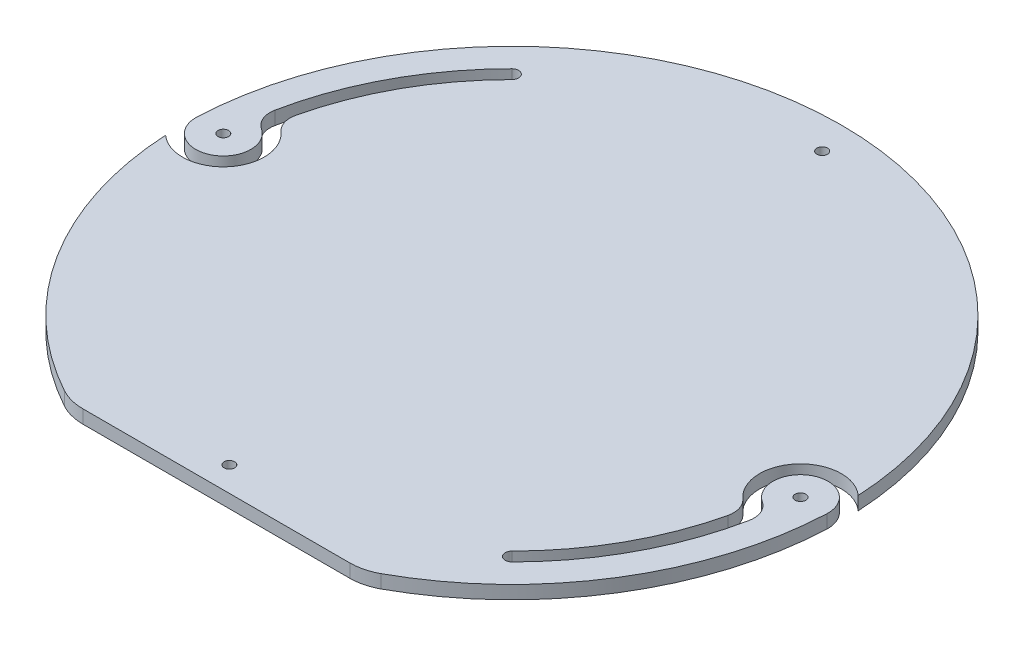
ISO-10303-21;
HEADER;
FILE_DESCRIPTION(('STEP AP214'),'2;1');
FILE_NAME('part.step','',(''),(''),'','','');
FILE_SCHEMA(('AUTOMOTIVE_DESIGN { 1 0 10303 214 1 1 1 1 }'));
ENDSEC;
DATA;
#1=APPLICATION_CONTEXT('core data for automotive mechanical design processes');
#2=APPLICATION_PROTOCOL_DEFINITION('international standard','automotive_design',2000,#1);
#3=PRODUCT_CONTEXT('',#1,'mechanical');
#4=PRODUCT('Part','Part','',(#3));
#5=PRODUCT_RELATED_PRODUCT_CATEGORY('part','',(#4));
#6=PRODUCT_DEFINITION_FORMATION('','',#4);
#7=PRODUCT_DEFINITION_CONTEXT('part definition',#1,'design');
#8=PRODUCT_DEFINITION('design','',#6,#7);
#9=PRODUCT_DEFINITION_SHAPE('','',#8);
#10=(LENGTH_UNIT() NAMED_UNIT(*) SI_UNIT(.MILLI.,.METRE.));
#11=(NAMED_UNIT(*) PLANE_ANGLE_UNIT() SI_UNIT($,.RADIAN.));
#12=(NAMED_UNIT(*) SI_UNIT($,.STERADIAN.) SOLID_ANGLE_UNIT());
#13=UNCERTAINTY_MEASURE_WITH_UNIT(LENGTH_MEASURE(1.E-05),#10,'distance_accuracy_value','');
#14=(GEOMETRIC_REPRESENTATION_CONTEXT(3) GLOBAL_UNCERTAINTY_ASSIGNED_CONTEXT((#13)) GLOBAL_UNIT_ASSIGNED_CONTEXT((#10,
#11,#12)) REPRESENTATION_CONTEXT('',''));
#15=CARTESIAN_POINT('',(0.,0.,0.));
#16=DIRECTION('',(0.,0.,1.));
#17=DIRECTION('',(1.,0.,0.));
#18=AXIS2_PLACEMENT_3D('',#15,#16,#17);
#19=CARTESIAN_POINT('',(0.,3.,0.));
#20=DIRECTION('',(0.,-1.,0.));
#21=DIRECTION('',(0.,0.,-1.));
#22=AXIS2_PLACEMENT_3D('',#19,#20,#21);
#23=CYLINDRICAL_SURFACE('',#22,74.2);
#24=CARTESIAN_POINT('',(0.,3.,0.));
#25=DIRECTION('',(0.,1.,0.));
#26=DIRECTION('',(0.,0.,1.));
#27=AXIS2_PLACEMENT_3D('',#24,#25,#26);
#28=CIRCLE('',#27,74.2);
#29=CARTESIAN_POINT('',(74.0993456822913,3.,-3.86354363975568));
#30=VERTEX_POINT('',#29);
#31=CARTESIAN_POINT('',(-74.1293780413738,3.,-3.23655854250791));
#32=VERTEX_POINT('',#31);
#33=EDGE_CURVE('E328',#30,#32,#28,.T.);
#34=ORIENTED_EDGE('',*,*,#33,.F.);
#35=DIRECTION('',(0.,1.,0.));
#36=VECTOR('',#35,1.);
#37=CARTESIAN_POINT('',(74.0993456822913,0.,-3.86354363975568));
#38=LINE('',#37,#36);
#39=CARTESIAN_POINT('',(74.0993456822913,0.,-3.86354363975568));
#40=VERTEX_POINT('',#39);
#41=EDGE_CURVE('E230',#40,#30,#38,.T.);
#42=ORIENTED_EDGE('',*,*,#41,.F.);
#43=CARTESIAN_POINT('',(0.,0.,0.));
#44=DIRECTION('',(0.,1.,0.));
#45=DIRECTION('',(0.,0.,1.));
#46=AXIS2_PLACEMENT_3D('',#43,#44,#45);
#47=CIRCLE('',#46,74.2);
#48=CARTESIAN_POINT('',(-74.1293780413738,0.,-3.23655854250791));
#49=VERTEX_POINT('',#48);
#50=EDGE_CURVE('E340',#40,#49,#47,.T.);
#51=ORIENTED_EDGE('',*,*,#50,.T.);
#52=DIRECTION('',(0.,1.,0.));
#53=VECTOR('',#52,1.);
#54=CARTESIAN_POINT('',(-74.1293780413738,0.,-3.23655854250791));
#55=LINE('',#54,#53);
#56=EDGE_CURVE('E287',#49,#32,#55,.T.);
#57=ORIENTED_EDGE('',*,*,#56,.T.);
#58=EDGE_LOOP('',(#34,#42,#51,#57));
#59=FACE_BOUND('',#58,.T.);
#60=ADVANCED_FACE('F33',(#59),#23,.T.);
#61=CARTESIAN_POINT('',(-74.0993456822913,3.,3.86354363975568));
#62=VERTEX_POINT('',#61);
#63=CARTESIAN_POINT('',(-35.6515891230551,3.,65.0738364705882));
#64=VERTEX_POINT('',#63);
#65=EDGE_CURVE('E322',#62,#64,#28,.T.);
#66=ORIENTED_EDGE('',*,*,#65,.F.);
#67=DIRECTION('',(0.,1.,0.));
#68=VECTOR('',#67,1.);
#69=CARTESIAN_POINT('',(-74.0993456822913,0.,3.86354363975568));
#70=LINE('',#69,#68);
#71=CARTESIAN_POINT('',(-74.0993456822913,0.,3.86354363975568));
#72=VERTEX_POINT('',#71);
#73=EDGE_CURVE('E285',#72,#62,#70,.T.);
#74=ORIENTED_EDGE('',*,*,#73,.F.);
#75=CARTESIAN_POINT('',(-35.6515891230551,0.,65.0738364705882));
#76=VERTEX_POINT('',#75);
#77=EDGE_CURVE('E335',#72,#76,#47,.T.);
#78=ORIENTED_EDGE('',*,*,#77,.T.);
#79=DIRECTION('',(0.,-1.,0.));
#80=VECTOR('',#79,1.);
#81=CARTESIAN_POINT('',(-35.6515891230551,3.,65.0738364705882));
#82=LINE('',#81,#80);
#83=EDGE_CURVE('E41',#64,#76,#82,.T.);
#84=ORIENTED_EDGE('',*,*,#83,.F.);
#85=EDGE_LOOP('',(#66,#74,#78,#84));
#86=FACE_BOUND('',#85,.T.);
#87=ADVANCED_FACE('F384',(#86),#23,.T.);
#88=CARTESIAN_POINT('',(30.0299773610639,3.,54.8128676470588));
#89=DIRECTION('',(0.,-1.,0.));
#90=DIRECTION('',(0.,0.,-1.));
#91=AXIS2_PLACEMENT_3D('',#88,#89,#90);
#92=CYLINDRICAL_SURFACE('',#91,11.7);
#93=CARTESIAN_POINT('',(30.0299773610639,0.,54.8128676470588));
#94=DIRECTION('',(0.,1.,0.));
#95=DIRECTION('',(0.,0.,1.));
#96=AXIS2_PLACEMENT_3D('',#93,#94,#95);
#97=CIRCLE('',#96,11.7);
#98=CARTESIAN_POINT('',(30.0299773610639,0.,66.5128676470588));
#99=VERTEX_POINT('',#98);
#100=CARTESIAN_POINT('',(35.6515891230551,0.,65.0738364705882));
#101=VERTEX_POINT('',#100);
#102=EDGE_CURVE('E316',#99,#101,#97,.T.);
#103=ORIENTED_EDGE('',*,*,#102,.T.);
#104=DIRECTION('',(0.,-1.,0.));
#105=VECTOR('',#104,1.);
#106=CARTESIAN_POINT('',(35.6515891230551,3.,65.0738364705882));
#107=LINE('',#106,#105);
#108=CARTESIAN_POINT('',(35.6515891230551,3.,65.0738364705882));
#109=VERTEX_POINT('',#108);
#110=EDGE_CURVE('E11',#109,#101,#107,.T.);
#111=ORIENTED_EDGE('',*,*,#110,.F.);
#112=CARTESIAN_POINT('',(30.0299773610639,3.,54.8128676470588));
#113=DIRECTION('',(0.,1.,0.));
#114=DIRECTION('',(0.,0.,1.));
#115=AXIS2_PLACEMENT_3D('',#112,#113,#114);
#116=CIRCLE('',#115,11.7);
#117=CARTESIAN_POINT('',(30.0299773610639,3.,66.5128676470588));
#118=VERTEX_POINT('',#117);
#119=EDGE_CURVE('E319',#118,#109,#116,.T.);
#120=ORIENTED_EDGE('',*,*,#119,.F.);
#121=DIRECTION('',(0.,-1.,0.));
#122=VECTOR('',#121,1.);
#123=CARTESIAN_POINT('',(30.0299773610639,3.,66.5128676470588));
#124=LINE('',#123,#122);
#125=EDGE_CURVE('E332',#118,#99,#124,.T.);
#126=ORIENTED_EDGE('',*,*,#125,.T.);
#127=EDGE_LOOP('',(#103,#111,#120,#126));
#128=FACE_BOUND('',#127,.T.);
#129=ADVANCED_FACE('F35',(#128),#92,.T.);
#130=CARTESIAN_POINT('',(74.1293780413738,0.,3.23655854250794));
#131=VERTEX_POINT('',#130);
#132=EDGE_CURVE('E336',#101,#131,#47,.T.);
#133=ORIENTED_EDGE('',*,*,#132,.T.);
#134=DIRECTION('',(0.,1.,0.));
#135=VECTOR('',#134,1.);
#136=CARTESIAN_POINT('',(74.1293780413738,0.,3.23655854250794));
#137=LINE('',#136,#135);
#138=CARTESIAN_POINT('',(74.1293780413738,3.,3.23655854250794));
#139=VERTEX_POINT('',#138);
#140=EDGE_CURVE('E232',#131,#139,#137,.T.);
#141=ORIENTED_EDGE('',*,*,#140,.T.);
#142=EDGE_CURVE('E324',#109,#139,#28,.T.);
#143=ORIENTED_EDGE('',*,*,#142,.F.);
#144=ORIENTED_EDGE('',*,*,#110,.T.);
#145=EDGE_LOOP('',(#133,#141,#143,#144));
#146=FACE_BOUND('',#145,.T.);
#147=ADVANCED_FACE('F412',(#146),#23,.T.);
#148=CARTESIAN_POINT('',(-30.0299773610639,3.,54.8128676470588));
#149=DIRECTION('',(0.,-1.,0.));
#150=DIRECTION('',(0.,0.,-1.));
#151=AXIS2_PLACEMENT_3D('',#148,#149,#150);
#152=CYLINDRICAL_SURFACE('',#151,11.7);
#153=CARTESIAN_POINT('',(-30.0299773610639,0.,54.8128676470588));
#154=DIRECTION('',(0.,1.,0.));
#155=DIRECTION('',(0.,0.,-1.));
#156=AXIS2_PLACEMENT_3D('',#153,#154,#155);
#157=CIRCLE('',#156,11.7);
#158=CARTESIAN_POINT('',(-30.0299773610639,0.,66.5128676470588));
#159=VERTEX_POINT('',#158);
#160=EDGE_CURVE('E339',#76,#159,#157,.T.);
#161=ORIENTED_EDGE('',*,*,#160,.T.);
#162=DIRECTION('',(0.,-1.,0.));
#163=VECTOR('',#162,1.);
#164=CARTESIAN_POINT('',(-30.0299773610639,3.,66.5128676470588));
#165=LINE('',#164,#163);
#166=CARTESIAN_POINT('',(-30.0299773610639,3.,66.5128676470588));
#167=VERTEX_POINT('',#166);
#168=EDGE_CURVE('E345',#167,#159,#165,.T.);
#169=ORIENTED_EDGE('',*,*,#168,.F.);
#170=CARTESIAN_POINT('',(-30.0299773610639,3.,54.8128676470588));
#171=DIRECTION('',(0.,1.,0.));
#172=DIRECTION('',(0.,0.,-1.));
#173=AXIS2_PLACEMENT_3D('',#170,#171,#172);
#174=CIRCLE('',#173,11.7);
#175=EDGE_CURVE('E327',#64,#167,#174,.T.);
#176=ORIENTED_EDGE('',*,*,#175,.F.);
#177=ORIENTED_EDGE('',*,*,#83,.T.);
#178=EDGE_LOOP('',(#161,#169,#176,#177));
#179=FACE_BOUND('',#178,.T.);
#180=ADVANCED_FACE('F352',(#179),#152,.T.);
#181=CARTESIAN_POINT('',(-30.0299773610639,3.,66.5128676470588));
#182=DIRECTION('',(0.,0.,-1.));
#183=DIRECTION('',(-1.,0.,0.));
#184=AXIS2_PLACEMENT_3D('',#181,#182,#183);
#185=PLANE('',#184);
#186=DIRECTION('',(1.,0.,0.));
#187=VECTOR('',#186,1.);
#188=CARTESIAN_POINT('',(-30.0299773610639,0.,66.5128676470588));
#189=LINE('',#188,#187);
#190=EDGE_CURVE('E323',#159,#99,#189,.T.);
#191=ORIENTED_EDGE('',*,*,#190,.T.);
#192=ORIENTED_EDGE('',*,*,#125,.F.);
#193=DIRECTION('',(1.,0.,0.));
#194=VECTOR('',#193,1.);
#195=CARTESIAN_POINT('',(-30.0299773610639,3.,66.5128676470588));
#196=LINE('',#195,#194);
#197=EDGE_CURVE('E330',#167,#118,#196,.T.);
#198=ORIENTED_EDGE('',*,*,#197,.F.);
#199=ORIENTED_EDGE('',*,*,#168,.T.);
#200=EDGE_LOOP('',(#191,#192,#198,#199));
#201=FACE_BOUND('',#200,.T.);
#202=ADVANCED_FACE('F361',(#201),#185,.F.);
#203=CARTESIAN_POINT('',(30.0299773610639,3.,54.8128676470588));
#204=DIRECTION('',(0.,1.,0.));
#205=DIRECTION('',(0.,0.,1.));
#206=AXIS2_PLACEMENT_3D('',#203,#204,#205);
#207=PLANE('',#206);
#208=CARTESIAN_POINT('',(67.9352790675663,3.,2.96611834084284));
#209=DIRECTION('',(0.,1.,0.));
#210=DIRECTION('',(0.,0.,-1.));
#211=AXIS2_PLACEMENT_3D('',#208,#209,#210);
#212=CIRCLE('',#211,9.2);
#213=CARTESIAN_POINT('',(61.7919150492533,3.,9.81440853172245));
#214=VERTEX_POINT('',#213);
#215=EDGE_CURVE('E218',#30,#214,#212,.T.);
#216=ORIENTED_EDGE('',*,*,#215,.F.);
#217=ORIENTED_EDGE('',*,*,#33,.T.);
#218=CARTESIAN_POINT('',(-67.9352790675663,3.,-2.96611834084284));
#219=DIRECTION('',(0.,-1.,0.));
#220=DIRECTION('',(0.,0.,1.));
#221=AXIS2_PLACEMENT_3D('',#218,#219,#220);
#222=CIRCLE('',#221,6.19999999999998);
#223=CARTESIAN_POINT('',(-64.5293719082212,3.,-8.14683223198966));
#224=VERTEX_POINT('',#223);
#225=EDGE_CURVE('E267',#224,#32,#222,.T.);
#226=ORIENTED_EDGE('',*,*,#225,.F.);
#227=CARTESIAN_POINT('',(-61.7826725861687,3.,-12.3248273054952));
#228=DIRECTION('',(0.,1.,0.));
#229=DIRECTION('',(0.,0.,-1.));
#230=AXIS2_PLACEMENT_3D('',#227,#228,#229);
#231=CIRCLE('',#230,5.);
#232=CARTESIAN_POINT('',(-66.6860592993567,3.,-13.3029882027567));
#233=VERTEX_POINT('',#232);
#234=EDGE_CURVE('E264',#233,#224,#231,.T.);
#235=ORIENTED_EDGE('',*,*,#234,.F.);
#236=CARTESIAN_POINT('',(0.,3.,0.));
#237=DIRECTION('',(0.,1.,0.));
#238=DIRECTION('',(0.,0.,-1.));
#239=AXIS2_PLACEMENT_3D('',#236,#237,#238);
#240=CIRCLE('',#239,68.);
#241=CARTESIAN_POINT('',(-48.0832611206855,3.,-48.083261120685));
#242=VERTEX_POINT('',#241);
#243=EDGE_CURVE('E261',#242,#233,#240,.T.);
#244=ORIENTED_EDGE('',*,*,#243,.F.);
#245=CARTESIAN_POINT('',(-47.0226009489056,3.,-47.0226009489051));
#246=DIRECTION('',(0.,1.,0.));
#247=DIRECTION('',(0.,0.,1.));
#248=AXIS2_PLACEMENT_3D('',#245,#246,#247);
#249=CIRCLE('',#248,1.5);
#250=CARTESIAN_POINT('',(-45.9619407771258,3.,-45.9619407771253));
#251=VERTEX_POINT('',#250);
#252=EDGE_CURVE('E225',#251,#242,#249,.T.);
#253=ORIENTED_EDGE('',*,*,#252,.F.);
#254=CARTESIAN_POINT('',(0.,3.,0.));
#255=DIRECTION('',(0.,-1.,0.));
#256=DIRECTION('',(0.,0.,1.));
#257=AXIS2_PLACEMENT_3D('',#254,#255,#256);
#258=CIRCLE('',#257,65.);
#259=CARTESIAN_POINT('',(-63.3242244447496,3.,-14.6643308224744));
#260=VERTEX_POINT('',#259);
#261=EDGE_CURVE('E242',#260,#251,#258,.T.);
#262=ORIENTED_EDGE('',*,*,#261,.F.);
#263=CARTESIAN_POINT('',(-58.453130256692,3.,-13.5363053745918));
#264=DIRECTION('',(0.,-1.,0.));
#265=DIRECTION('',(0.,0.,1.));
#266=AXIS2_PLACEMENT_3D('',#263,#264,#265);
#267=CIRCLE('',#266,4.99999999999999);
#268=CARTESIAN_POINT('',(-61.7919150492533,3.,-9.81440853172244));
#269=VERTEX_POINT('',#268);
#270=EDGE_CURVE('E273',#269,#260,#267,.T.);
#271=ORIENTED_EDGE('',*,*,#270,.F.);
#272=CARTESIAN_POINT('',(-67.9352790675663,3.,-2.96611834084284));
#273=DIRECTION('',(0.,1.,0.));
#274=DIRECTION('',(0.,0.,-1.));
#275=AXIS2_PLACEMENT_3D('',#272,#273,#274);
#276=CIRCLE('',#275,9.19999999999999);
#277=EDGE_CURVE('E270',#62,#269,#276,.T.);
#278=ORIENTED_EDGE('',*,*,#277,.F.);
#279=ORIENTED_EDGE('',*,*,#65,.T.);
#280=ORIENTED_EDGE('',*,*,#175,.T.);
#281=ORIENTED_EDGE('',*,*,#197,.T.);
#282=ORIENTED_EDGE('',*,*,#119,.T.);
#283=ORIENTED_EDGE('',*,*,#142,.T.);
#284=CARTESIAN_POINT('',(67.9352790675663,3.,2.96611834084284));
#285=DIRECTION('',(0.,-1.,0.));
#286=DIRECTION('',(0.,0.,1.));
#287=AXIS2_PLACEMENT_3D('',#284,#285,#286);
#288=CIRCLE('',#287,6.20000000000001);
#289=CARTESIAN_POINT('',(64.5293719082212,3.,8.14683223198967));
#290=VERTEX_POINT('',#289);
#291=EDGE_CURVE('E216',#290,#139,#288,.T.);
#292=ORIENTED_EDGE('',*,*,#291,.F.);
#293=CARTESIAN_POINT('',(61.7826725861687,3.,12.3248273054952));
#294=DIRECTION('',(0.,1.,0.));
#295=DIRECTION('',(0.,0.,-1.));
#296=AXIS2_PLACEMENT_3D('',#293,#294,#295);
#297=CIRCLE('',#296,5.);
#298=CARTESIAN_POINT('',(66.6860592993567,3.,13.3029882027567));
#299=VERTEX_POINT('',#298);
#300=EDGE_CURVE('E213',#299,#290,#297,.T.);
#301=ORIENTED_EDGE('',*,*,#300,.F.);
#302=CARTESIAN_POINT('',(0.,3.,0.));
#303=DIRECTION('',(0.,1.,0.));
#304=DIRECTION('',(0.,0.,-1.));
#305=AXIS2_PLACEMENT_3D('',#302,#303,#304);
#306=CIRCLE('',#305,68.);
#307=CARTESIAN_POINT('',(48.0832611206854,3.,48.083261120685));
#308=VERTEX_POINT('',#307);
#309=EDGE_CURVE('E211',#308,#299,#306,.T.);
#310=ORIENTED_EDGE('',*,*,#309,.F.);
#311=CARTESIAN_POINT('',(47.0226009489056,3.,47.0226009489051));
#312=DIRECTION('',(0.,1.,0.));
#313=DIRECTION('',(0.,0.,1.));
#314=AXIS2_PLACEMENT_3D('',#311,#312,#313);
#315=CIRCLE('',#314,1.5);
#316=CARTESIAN_POINT('',(45.9619407771258,3.,45.9619407771253));
#317=VERTEX_POINT('',#316);
#318=EDGE_CURVE('E177',#317,#308,#315,.T.);
#319=ORIENTED_EDGE('',*,*,#318,.F.);
#320=CARTESIAN_POINT('',(0.,3.,0.));
#321=DIRECTION('',(0.,-1.,0.));
#322=DIRECTION('',(0.,0.,1.));
#323=AXIS2_PLACEMENT_3D('',#320,#321,#322);
#324=CIRCLE('',#323,65.);
#325=CARTESIAN_POINT('',(63.3242244447496,3.,14.6643308224744));
#326=VERTEX_POINT('',#325);
#327=EDGE_CURVE('E194',#326,#317,#324,.T.);
#328=ORIENTED_EDGE('',*,*,#327,.F.);
#329=CARTESIAN_POINT('',(58.4531302566919,3.,13.5363053745918));
#330=DIRECTION('',(0.,-1.,0.));
#331=DIRECTION('',(0.,0.,1.));
#332=AXIS2_PLACEMENT_3D('',#329,#330,#331);
#333=CIRCLE('',#332,4.99999999999999);
#334=EDGE_CURVE('E197',#214,#326,#333,.T.);
#335=ORIENTED_EDGE('',*,*,#334,.F.);
#336=EDGE_LOOP('',(#216,#217,#226,#235,#244,#253,#262,#271,#278,#279,#280,#281,#282,#283,#292,
#301,#310,#319,#328,#335));
#337=FACE_BOUND('',#336,.T.);
#338=CARTESIAN_POINT('',(-67.9352790675663,3.,-2.96611834084284));
#339=DIRECTION('',(0.,1.,0.));
#340=DIRECTION('',(0.,0.,1.));
#341=AXIS2_PLACEMENT_3D('',#338,#339,#340);
#342=CIRCLE('',#341,1.2);
#343=CARTESIAN_POINT('',(-67.9352790675663,3.,-1.76611834084284));
#344=VERTEX_POINT('',#343);
#345=EDGE_CURVE('E299',#344,#344,#342,.T.);
#346=ORIENTED_EDGE('',*,*,#345,.F.);
#347=EDGE_LOOP('',(#346));
#348=FACE_BOUND('',#347,.T.);
#349=CARTESIAN_POINT('',(2.9224989534775,3.,-66.9362308459845));
#350=DIRECTION('',(0.,1.,0.));
#351=DIRECTION('',(0.,0.,1.));
#352=AXIS2_PLACEMENT_3D('',#349,#350,#351);
#353=CIRCLE('',#352,1.2);
#354=CARTESIAN_POINT('',(2.9224989534775,3.,-65.7362308459845));
#355=VERTEX_POINT('',#354);
#356=EDGE_CURVE('E305',#355,#355,#353,.T.);
#357=ORIENTED_EDGE('',*,*,#356,.F.);
#358=EDGE_LOOP('',(#357));
#359=FACE_BOUND('',#358,.T.);
#360=CARTESIAN_POINT('',(67.9352790675663,3.,2.96611834084284));
#361=DIRECTION('',(0.,1.,0.));
#362=DIRECTION('',(0.,0.,1.));
#363=AXIS2_PLACEMENT_3D('',#360,#361,#362);
#364=CIRCLE('',#363,1.2);
#365=CARTESIAN_POINT('',(67.9352790675663,3.,4.16611834084284));
#366=VERTEX_POINT('',#365);
#367=EDGE_CURVE('E280',#366,#366,#364,.T.);
#368=ORIENTED_EDGE('',*,*,#367,.F.);
#369=EDGE_LOOP('',(#368));
#370=FACE_BOUND('',#369,.T.);
#371=CARTESIAN_POINT('',(-2.66078262928549,3.,60.9419415164933));
#372=DIRECTION('',(0.,1.,0.));
#373=DIRECTION('',(0.,0.,1.));
#374=AXIS2_PLACEMENT_3D('',#371,#372,#373);
#375=CIRCLE('',#374,1.2);
#376=CARTESIAN_POINT('',(-2.66078262928549,3.,62.1419415164933));
#377=VERTEX_POINT('',#376);
#378=EDGE_CURVE('E298',#377,#377,#375,.T.);
#379=ORIENTED_EDGE('',*,*,#378,.F.);
#380=EDGE_LOOP('',(#379));
#381=FACE_BOUND('',#380,.T.);
#382=ADVANCED_FACE('F368',(#337,#348,#359,#370,#381),#207,.T.);
#383=CARTESIAN_POINT('',(30.0299773610639,0.,54.8128676470588));
#384=DIRECTION('',(0.,1.,0.));
#385=DIRECTION('',(0.,0.,1.));
#386=AXIS2_PLACEMENT_3D('',#383,#384,#385);
#387=PLANE('',#386);
#388=ORIENTED_EDGE('',*,*,#50,.F.);
#389=CARTESIAN_POINT('',(67.9352790675663,0.,2.96611834084284));
#390=DIRECTION('',(0.,1.,0.));
#391=DIRECTION('',(0.,0.,-1.));
#392=AXIS2_PLACEMENT_3D('',#389,#390,#391);
#393=CIRCLE('',#392,9.2);
#394=CARTESIAN_POINT('',(61.7919150492533,0.,9.81440853172245));
#395=VERTEX_POINT('',#394);
#396=EDGE_CURVE('E204',#40,#395,#393,.T.);
#397=ORIENTED_EDGE('',*,*,#396,.T.);
#398=CARTESIAN_POINT('',(58.4531302566919,0.,13.5363053745918));
#399=DIRECTION('',(0.,-1.,0.));
#400=DIRECTION('',(0.,0.,1.));
#401=AXIS2_PLACEMENT_3D('',#398,#399,#400);
#402=CIRCLE('',#401,4.99999999999999);
#403=CARTESIAN_POINT('',(63.3242244447496,0.,14.6643308224744));
#404=VERTEX_POINT('',#403);
#405=EDGE_CURVE('E207',#395,#404,#402,.T.);
#406=ORIENTED_EDGE('',*,*,#405,.T.);
#407=CARTESIAN_POINT('',(0.,0.,0.));
#408=DIRECTION('',(0.,-1.,0.));
#409=DIRECTION('',(0.,0.,1.));
#410=AXIS2_PLACEMENT_3D('',#407,#408,#409);
#411=CIRCLE('',#410,65.);
#412=CARTESIAN_POINT('',(45.9619407771258,0.,45.9619407771253));
#413=VERTEX_POINT('',#412);
#414=EDGE_CURVE('E182',#404,#413,#411,.T.);
#415=ORIENTED_EDGE('',*,*,#414,.T.);
#416=CARTESIAN_POINT('',(47.0226009489056,0.,47.0226009489051));
#417=DIRECTION('',(0.,1.,0.));
#418=DIRECTION('',(0.,0.,1.));
#419=AXIS2_PLACEMENT_3D('',#416,#417,#418);
#420=CIRCLE('',#419,1.5);
#421=CARTESIAN_POINT('',(48.0832611206854,0.,48.083261120685));
#422=VERTEX_POINT('',#421);
#423=EDGE_CURVE('E174',#413,#422,#420,.T.);
#424=ORIENTED_EDGE('',*,*,#423,.T.);
#425=CARTESIAN_POINT('',(0.,0.,0.));
#426=DIRECTION('',(0.,1.,0.));
#427=DIRECTION('',(0.,0.,-1.));
#428=AXIS2_PLACEMENT_3D('',#425,#426,#427);
#429=CIRCLE('',#428,68.);
#430=CARTESIAN_POINT('',(66.6860592993567,0.,13.3029882027567));
#431=VERTEX_POINT('',#430);
#432=EDGE_CURVE('E185',#422,#431,#429,.T.);
#433=ORIENTED_EDGE('',*,*,#432,.T.);
#434=CARTESIAN_POINT('',(61.7826725861687,0.,12.3248273054952));
#435=DIRECTION('',(0.,1.,0.));
#436=DIRECTION('',(0.,0.,-1.));
#437=AXIS2_PLACEMENT_3D('',#434,#435,#436);
#438=CIRCLE('',#437,5.);
#439=CARTESIAN_POINT('',(64.5293719082212,0.,8.14683223198967));
#440=VERTEX_POINT('',#439);
#441=EDGE_CURVE('E48',#431,#440,#438,.T.);
#442=ORIENTED_EDGE('',*,*,#441,.T.);
#443=CARTESIAN_POINT('',(67.9352790675663,0.,2.96611834084284));
#444=DIRECTION('',(0.,-1.,0.));
#445=DIRECTION('',(0.,0.,1.));
#446=AXIS2_PLACEMENT_3D('',#443,#444,#445);
#447=CIRCLE('',#446,6.20000000000001);
#448=EDGE_CURVE('E201',#440,#131,#447,.T.);
#449=ORIENTED_EDGE('',*,*,#448,.T.);
#450=ORIENTED_EDGE('',*,*,#132,.F.);
#451=ORIENTED_EDGE('',*,*,#102,.F.);
#452=ORIENTED_EDGE('',*,*,#190,.F.);
#453=ORIENTED_EDGE('',*,*,#160,.F.);
#454=ORIENTED_EDGE('',*,*,#77,.F.);
#455=CARTESIAN_POINT('',(-67.9352790675663,0.,-2.96611834084284));
#456=DIRECTION('',(0.,1.,0.));
#457=DIRECTION('',(0.,0.,-1.));
#458=AXIS2_PLACEMENT_3D('',#455,#456,#457);
#459=CIRCLE('',#458,9.19999999999999);
#460=CARTESIAN_POINT('',(-61.7919150492533,0.,-9.81440853172244));
#461=VERTEX_POINT('',#460);
#462=EDGE_CURVE('E249',#72,#461,#459,.T.);
#463=ORIENTED_EDGE('',*,*,#462,.T.);
#464=CARTESIAN_POINT('',(-58.453130256692,0.,-13.5363053745918));
#465=DIRECTION('',(0.,-1.,0.));
#466=DIRECTION('',(0.,0.,1.));
#467=AXIS2_PLACEMENT_3D('',#464,#465,#466);
#468=CIRCLE('',#467,4.99999999999999);
#469=CARTESIAN_POINT('',(-63.3242244447496,0.,-14.6643308224744));
#470=VERTEX_POINT('',#469);
#471=EDGE_CURVE('E252',#461,#470,#468,.T.);
#472=ORIENTED_EDGE('',*,*,#471,.T.);
#473=CARTESIAN_POINT('',(0.,0.,0.));
#474=DIRECTION('',(0.,-1.,0.));
#475=DIRECTION('',(0.,0.,1.));
#476=AXIS2_PLACEMENT_3D('',#473,#474,#475);
#477=CIRCLE('',#476,65.);
#478=CARTESIAN_POINT('',(-45.9619407771258,0.,-45.9619407771253));
#479=VERTEX_POINT('',#478);
#480=EDGE_CURVE('E255',#470,#479,#477,.T.);
#481=ORIENTED_EDGE('',*,*,#480,.T.);
#482=CARTESIAN_POINT('',(-47.0226009489056,0.,-47.0226009489051));
#483=DIRECTION('',(0.,1.,0.));
#484=DIRECTION('',(0.,0.,1.));
#485=AXIS2_PLACEMENT_3D('',#482,#483,#484);
#486=CIRCLE('',#485,1.5);
#487=CARTESIAN_POINT('',(-48.0832611206855,0.,-48.083261120685));
#488=VERTEX_POINT('',#487);
#489=EDGE_CURVE('E238',#479,#488,#486,.T.);
#490=ORIENTED_EDGE('',*,*,#489,.T.);
#491=CARTESIAN_POINT('',(0.,0.,0.));
#492=DIRECTION('',(0.,1.,0.));
#493=DIRECTION('',(0.,0.,-1.));
#494=AXIS2_PLACEMENT_3D('',#491,#492,#493);
#495=CIRCLE('',#494,68.);
#496=CARTESIAN_POINT('',(-66.6860592993567,0.,-13.3029882027567));
#497=VERTEX_POINT('',#496);
#498=EDGE_CURVE('E241',#488,#497,#495,.T.);
#499=ORIENTED_EDGE('',*,*,#498,.T.);
#500=CARTESIAN_POINT('',(-61.7826725861687,0.,-12.3248273054952));
#501=DIRECTION('',(0.,1.,0.));
#502=DIRECTION('',(0.,0.,-1.));
#503=AXIS2_PLACEMENT_3D('',#500,#501,#502);
#504=CIRCLE('',#503,5.);
#505=CARTESIAN_POINT('',(-64.5293719082212,0.,-8.14683223198966));
#506=VERTEX_POINT('',#505);
#507=EDGE_CURVE('E56',#497,#506,#504,.T.);
#508=ORIENTED_EDGE('',*,*,#507,.T.);
#509=CARTESIAN_POINT('',(-67.9352790675663,0.,-2.96611834084284));
#510=DIRECTION('',(0.,-1.,0.));
#511=DIRECTION('',(0.,0.,1.));
#512=AXIS2_PLACEMENT_3D('',#509,#510,#511);
#513=CIRCLE('',#512,6.19999999999998);
#514=EDGE_CURVE('E246',#506,#49,#513,.T.);
#515=ORIENTED_EDGE('',*,*,#514,.T.);
#516=EDGE_LOOP('',(#388,#397,#406,#415,#424,#433,#442,#449,#450,#451,#452,#453,#454,#463,#472,
#481,#490,#499,#508,#515));
#517=FACE_BOUND('',#516,.T.);
#518=CARTESIAN_POINT('',(-67.9352790675663,0.,-2.96611834084284));
#519=DIRECTION('',(0.,1.,0.));
#520=DIRECTION('',(0.,0.,1.));
#521=AXIS2_PLACEMENT_3D('',#518,#519,#520);
#522=CIRCLE('',#521,1.2);
#523=CARTESIAN_POINT('',(-67.9352790675663,0.,-1.76611834084284));
#524=VERTEX_POINT('',#523);
#525=EDGE_CURVE('E295',#524,#524,#522,.T.);
#526=ORIENTED_EDGE('',*,*,#525,.T.);
#527=EDGE_LOOP('',(#526));
#528=FACE_BOUND('',#527,.T.);
#529=CARTESIAN_POINT('',(2.9224989534775,0.,-66.9362308459845));
#530=DIRECTION('',(0.,1.,0.));
#531=DIRECTION('',(0.,0.,1.));
#532=AXIS2_PLACEMENT_3D('',#529,#530,#531);
#533=CIRCLE('',#532,1.2);
#534=CARTESIAN_POINT('',(2.9224989534775,0.,-65.7362308459845));
#535=VERTEX_POINT('',#534);
#536=EDGE_CURVE('E302',#535,#535,#533,.T.);
#537=ORIENTED_EDGE('',*,*,#536,.T.);
#538=EDGE_LOOP('',(#537));
#539=FACE_BOUND('',#538,.T.);
#540=CARTESIAN_POINT('',(67.9352790675663,0.,2.96611834084284));
#541=DIRECTION('',(0.,1.,0.));
#542=DIRECTION('',(0.,0.,1.));
#543=AXIS2_PLACEMENT_3D('',#540,#541,#542);
#544=CIRCLE('',#543,1.2);
#545=CARTESIAN_POINT('',(67.9352790675663,0.,4.16611834084284));
#546=VERTEX_POINT('',#545);
#547=EDGE_CURVE('E308',#546,#546,#544,.T.);
#548=ORIENTED_EDGE('',*,*,#547,.T.);
#549=EDGE_LOOP('',(#548));
#550=FACE_BOUND('',#549,.T.);
#551=CARTESIAN_POINT('',(-2.66078262928549,0.,60.9419415164933));
#552=DIRECTION('',(0.,1.,0.));
#553=DIRECTION('',(0.,0.,1.));
#554=AXIS2_PLACEMENT_3D('',#551,#552,#553);
#555=CIRCLE('',#554,1.2);
#556=CARTESIAN_POINT('',(-2.66078262928549,0.,62.1419415164933));
#557=VERTEX_POINT('',#556);
#558=EDGE_CURVE('E313',#557,#557,#555,.T.);
#559=ORIENTED_EDGE('',*,*,#558,.T.);
#560=EDGE_LOOP('',(#559));
#561=FACE_BOUND('',#560,.T.);
#562=ADVANCED_FACE('F190',(#517,#528,#539,#550,#561),#387,.F.);
#563=CARTESIAN_POINT('',(-2.66078262928549,0.,60.9419415164933));
#564=DIRECTION('',(0.,1.,0.));
#565=DIRECTION('',(0.,0.,1.));
#566=AXIS2_PLACEMENT_3D('',#563,#564,#565);
#567=CYLINDRICAL_SURFACE('',#566,1.2);
#568=ORIENTED_EDGE('',*,*,#558,.F.);
#569=EDGE_LOOP('',(#568));
#570=FACE_BOUND('',#569,.T.);
#571=ORIENTED_EDGE('',*,*,#378,.T.);
#572=EDGE_LOOP('',(#571));
#573=FACE_BOUND('',#572,.T.);
#574=ADVANCED_FACE('F573',(#570,#573),#567,.F.);
#575=CARTESIAN_POINT('',(67.9352790675663,0.,2.96611834084284));
#576=DIRECTION('',(0.,1.,0.));
#577=DIRECTION('',(0.,0.,1.));
#578=AXIS2_PLACEMENT_3D('',#575,#576,#577);
#579=CYLINDRICAL_SURFACE('',#578,1.2);
#580=ORIENTED_EDGE('',*,*,#547,.F.);
#581=EDGE_LOOP('',(#580));
#582=FACE_BOUND('',#581,.T.);
#583=ORIENTED_EDGE('',*,*,#367,.T.);
#584=EDGE_LOOP('',(#583));
#585=FACE_BOUND('',#584,.T.);
#586=ADVANCED_FACE('F564',(#582,#585),#579,.F.);
#587=CARTESIAN_POINT('',(2.9224989534775,0.,-66.9362308459845));
#588=DIRECTION('',(0.,1.,0.));
#589=DIRECTION('',(0.,0.,1.));
#590=AXIS2_PLACEMENT_3D('',#587,#588,#589);
#591=CYLINDRICAL_SURFACE('',#590,1.2);
#592=ORIENTED_EDGE('',*,*,#536,.F.);
#593=EDGE_LOOP('',(#592));
#594=FACE_BOUND('',#593,.T.);
#595=ORIENTED_EDGE('',*,*,#356,.T.);
#596=EDGE_LOOP('',(#595));
#597=FACE_BOUND('',#596,.T.);
#598=ADVANCED_FACE('F555',(#594,#597),#591,.F.);
#599=CARTESIAN_POINT('',(-67.9352790675663,0.,-2.96611834084284));
#600=DIRECTION('',(0.,1.,0.));
#601=DIRECTION('',(0.,0.,1.));
#602=AXIS2_PLACEMENT_3D('',#599,#600,#601);
#603=CYLINDRICAL_SURFACE('',#602,1.2);
#604=ORIENTED_EDGE('',*,*,#525,.F.);
#605=EDGE_LOOP('',(#604));
#606=FACE_BOUND('',#605,.T.);
#607=ORIENTED_EDGE('',*,*,#345,.T.);
#608=EDGE_LOOP('',(#607));
#609=FACE_BOUND('',#608,.T.);
#610=ADVANCED_FACE('F537',(#606,#609),#603,.F.);
#611=CARTESIAN_POINT('',(-47.0226009489056,0.,-47.0226009489051));
#612=DIRECTION('',(0.,1.,0.));
#613=DIRECTION('',(0.,0.,1.));
#614=AXIS2_PLACEMENT_3D('',#611,#612,#613);
#615=CYLINDRICAL_SURFACE('',#614,1.5);
#616=ORIENTED_EDGE('',*,*,#252,.T.);
#617=DIRECTION('',(0.,1.,0.));
#618=VECTOR('',#617,1.);
#619=CARTESIAN_POINT('',(-48.0832611206855,0.,-48.083261120685));
#620=LINE('',#619,#618);
#621=EDGE_CURVE('E258',#488,#242,#620,.T.);
#622=ORIENTED_EDGE('',*,*,#621,.F.);
#623=ORIENTED_EDGE('',*,*,#489,.F.);
#624=DIRECTION('',(0.,1.,0.));
#625=VECTOR('',#624,1.);
#626=CARTESIAN_POINT('',(-45.9619407771258,0.,-45.9619407771253));
#627=LINE('',#626,#625);
#628=EDGE_CURVE('E278',#479,#251,#627,.T.);
#629=ORIENTED_EDGE('',*,*,#628,.T.);
#630=EDGE_LOOP('',(#616,#622,#623,#629));
#631=FACE_BOUND('',#630,.T.);
#632=ADVANCED_FACE('F397',(#631),#615,.F.);
#633=CARTESIAN_POINT('',(0.,0.,0.));
#634=DIRECTION('',(0.,1.,0.));
#635=DIRECTION('',(0.,0.,1.));
#636=AXIS2_PLACEMENT_3D('',#633,#634,#635);
#637=CYLINDRICAL_SURFACE('',#636,65.);
#638=ORIENTED_EDGE('',*,*,#261,.T.);
#639=ORIENTED_EDGE('',*,*,#628,.F.);
#640=ORIENTED_EDGE('',*,*,#480,.F.);
#641=DIRECTION('',(0.,1.,0.));
#642=VECTOR('',#641,1.);
#643=CARTESIAN_POINT('',(-63.3242244447496,0.,-14.6643308224744));
#644=LINE('',#643,#642);
#645=EDGE_CURVE('E281',#470,#260,#644,.T.);
#646=ORIENTED_EDGE('',*,*,#645,.T.);
#647=EDGE_LOOP('',(#638,#639,#640,#646));
#648=FACE_BOUND('',#647,.T.);
#649=ADVANCED_FACE('F393',(#648),#637,.T.);
#650=CARTESIAN_POINT('',(-58.453130256692,0.,-13.5363053745918));
#651=DIRECTION('',(0.,1.,0.));
#652=DIRECTION('',(0.,0.,1.));
#653=AXIS2_PLACEMENT_3D('',#650,#651,#652);
#654=CYLINDRICAL_SURFACE('',#653,4.99999999999999);
#655=ORIENTED_EDGE('',*,*,#270,.T.);
#656=ORIENTED_EDGE('',*,*,#645,.F.);
#657=ORIENTED_EDGE('',*,*,#471,.F.);
#658=DIRECTION('',(0.,1.,0.));
#659=VECTOR('',#658,1.);
#660=CARTESIAN_POINT('',(-61.7919150492533,0.,-9.81440853172244));
#661=LINE('',#660,#659);
#662=EDGE_CURVE('E283',#461,#269,#661,.T.);
#663=ORIENTED_EDGE('',*,*,#662,.T.);
#664=EDGE_LOOP('',(#655,#656,#657,#663));
#665=FACE_BOUND('',#664,.T.);
#666=ADVANCED_FACE('F390',(#665),#654,.T.);
#667=CARTESIAN_POINT('',(-67.9352790675663,0.,-2.96611834084284));
#668=DIRECTION('',(0.,1.,0.));
#669=DIRECTION('',(0.,0.,1.));
#670=AXIS2_PLACEMENT_3D('',#667,#668,#669);
#671=CYLINDRICAL_SURFACE('',#670,9.19999999999999);
#672=ORIENTED_EDGE('',*,*,#277,.T.);
#673=ORIENTED_EDGE('',*,*,#662,.F.);
#674=ORIENTED_EDGE('',*,*,#462,.F.);
#675=ORIENTED_EDGE('',*,*,#73,.T.);
#676=EDGE_LOOP('',(#672,#673,#674,#675));
#677=FACE_BOUND('',#676,.T.);
#678=ADVANCED_FACE('F386',(#677),#671,.F.);
#679=CARTESIAN_POINT('',(-67.9352790675663,0.,-2.96611834084284));
#680=DIRECTION('',(0.,1.,0.));
#681=DIRECTION('',(0.,0.,1.));
#682=AXIS2_PLACEMENT_3D('',#679,#680,#681);
#683=CYLINDRICAL_SURFACE('',#682,6.19999999999998);
#684=ORIENTED_EDGE('',*,*,#225,.T.);
#685=ORIENTED_EDGE('',*,*,#56,.F.);
#686=ORIENTED_EDGE('',*,*,#514,.F.);
#687=DIRECTION('',(0.,1.,0.));
#688=VECTOR('',#687,1.);
#689=CARTESIAN_POINT('',(-64.5293719082212,0.,-8.14683223198966));
#690=LINE('',#689,#688);
#691=EDGE_CURVE('E290',#506,#224,#690,.T.);
#692=ORIENTED_EDGE('',*,*,#691,.T.);
#693=EDGE_LOOP('',(#684,#685,#686,#692));
#694=FACE_BOUND('',#693,.T.);
#695=ADVANCED_FACE('F382',(#694),#683,.T.);
#696=CARTESIAN_POINT('',(-61.7826725861687,0.,-12.3248273054952));
#697=DIRECTION('',(0.,1.,0.));
#698=DIRECTION('',(0.,0.,1.));
#699=AXIS2_PLACEMENT_3D('',#696,#697,#698);
#700=CYLINDRICAL_SURFACE('',#699,5.);
#701=ORIENTED_EDGE('',*,*,#234,.T.);
#702=ORIENTED_EDGE('',*,*,#691,.F.);
#703=ORIENTED_EDGE('',*,*,#507,.F.);
#704=DIRECTION('',(0.,1.,0.));
#705=VECTOR('',#704,1.);
#706=CARTESIAN_POINT('',(-66.6860592993567,0.,-13.3029882027567));
#707=LINE('',#706,#705);
#708=EDGE_CURVE('E292',#497,#233,#707,.T.);
#709=ORIENTED_EDGE('',*,*,#708,.T.);
#710=EDGE_LOOP('',(#701,#702,#703,#709));
#711=FACE_BOUND('',#710,.T.);
#712=ADVANCED_FACE('F402',(#711),#700,.F.);
#713=CARTESIAN_POINT('',(0.,0.,0.));
#714=DIRECTION('',(0.,1.,0.));
#715=DIRECTION('',(0.,0.,1.));
#716=AXIS2_PLACEMENT_3D('',#713,#714,#715);
#717=CYLINDRICAL_SURFACE('',#716,68.);
#718=ORIENTED_EDGE('',*,*,#243,.T.);
#719=ORIENTED_EDGE('',*,*,#708,.F.);
#720=ORIENTED_EDGE('',*,*,#498,.F.);
#721=ORIENTED_EDGE('',*,*,#621,.T.);
#722=EDGE_LOOP('',(#718,#719,#720,#721));
#723=FACE_BOUND('',#722,.T.);
#724=ADVANCED_FACE('F400',(#723),#717,.F.);
#725=CARTESIAN_POINT('',(47.0226009489056,0.,47.0226009489051));
#726=DIRECTION('',(0.,1.,0.));
#727=DIRECTION('',(0.,0.,1.));
#728=AXIS2_PLACEMENT_3D('',#725,#726,#727);
#729=CYLINDRICAL_SURFACE('',#728,1.5);
#730=ORIENTED_EDGE('',*,*,#318,.T.);
#731=DIRECTION('',(0.,1.,0.));
#732=VECTOR('',#731,1.);
#733=CARTESIAN_POINT('',(48.0832611206854,0.,48.083261120685));
#734=LINE('',#733,#732);
#735=EDGE_CURVE('E170',#422,#308,#734,.T.);
#736=ORIENTED_EDGE('',*,*,#735,.F.);
#737=ORIENTED_EDGE('',*,*,#423,.F.);
#738=DIRECTION('',(0.,1.,0.));
#739=VECTOR('',#738,1.);
#740=CARTESIAN_POINT('',(45.9619407771258,0.,45.9619407771253));
#741=LINE('',#740,#739);
#742=EDGE_CURVE('E223',#413,#317,#741,.T.);
#743=ORIENTED_EDGE('',*,*,#742,.T.);
#744=EDGE_LOOP('',(#730,#736,#737,#743));
#745=FACE_BOUND('',#744,.T.);
#746=ADVANCED_FACE('F172',(#745),#729,.F.);
#747=CARTESIAN_POINT('',(0.,0.,0.));
#748=DIRECTION('',(0.,1.,0.));
#749=DIRECTION('',(0.,0.,1.));
#750=AXIS2_PLACEMENT_3D('',#747,#748,#749);
#751=CYLINDRICAL_SURFACE('',#750,65.);
#752=ORIENTED_EDGE('',*,*,#327,.T.);
#753=ORIENTED_EDGE('',*,*,#742,.F.);
#754=ORIENTED_EDGE('',*,*,#414,.F.);
#755=DIRECTION('',(0.,1.,0.));
#756=VECTOR('',#755,1.);
#757=CARTESIAN_POINT('',(63.3242244447496,0.,14.6643308224744));
#758=LINE('',#757,#756);
#759=EDGE_CURVE('E226',#404,#326,#758,.T.);
#760=ORIENTED_EDGE('',*,*,#759,.T.);
#761=EDGE_LOOP('',(#752,#753,#754,#760));
#762=FACE_BOUND('',#761,.T.);
#763=ADVANCED_FACE('F441',(#762),#751,.T.);
#764=CARTESIAN_POINT('',(58.4531302566919,0.,13.5363053745918));
#765=DIRECTION('',(0.,1.,0.));
#766=DIRECTION('',(0.,0.,1.));
#767=AXIS2_PLACEMENT_3D('',#764,#765,#766);
#768=CYLINDRICAL_SURFACE('',#767,4.99999999999999);
#769=ORIENTED_EDGE('',*,*,#334,.T.);
#770=ORIENTED_EDGE('',*,*,#759,.F.);
#771=ORIENTED_EDGE('',*,*,#405,.F.);
#772=DIRECTION('',(0.,1.,0.));
#773=VECTOR('',#772,1.);
#774=CARTESIAN_POINT('',(61.7919150492533,0.,9.81440853172245));
#775=LINE('',#774,#773);
#776=EDGE_CURVE('E228',#395,#214,#775,.T.);
#777=ORIENTED_EDGE('',*,*,#776,.T.);
#778=EDGE_LOOP('',(#769,#770,#771,#777));
#779=FACE_BOUND('',#778,.T.);
#780=ADVANCED_FACE('F480',(#779),#768,.T.);
#781=CARTESIAN_POINT('',(67.9352790675663,0.,2.96611834084284));
#782=DIRECTION('',(0.,1.,0.));
#783=DIRECTION('',(0.,0.,1.));
#784=AXIS2_PLACEMENT_3D('',#781,#782,#783);
#785=CYLINDRICAL_SURFACE('',#784,9.2);
#786=ORIENTED_EDGE('',*,*,#215,.T.);
#787=ORIENTED_EDGE('',*,*,#776,.F.);
#788=ORIENTED_EDGE('',*,*,#396,.F.);
#789=ORIENTED_EDGE('',*,*,#41,.T.);
#790=EDGE_LOOP('',(#786,#787,#788,#789));
#791=FACE_BOUND('',#790,.T.);
#792=ADVANCED_FACE('F435',(#791),#785,.F.);
#793=CARTESIAN_POINT('',(67.9352790675663,0.,2.96611834084284));
#794=DIRECTION('',(0.,1.,0.));
#795=DIRECTION('',(0.,0.,1.));
#796=AXIS2_PLACEMENT_3D('',#793,#794,#795);
#797=CYLINDRICAL_SURFACE('',#796,6.20000000000001);
#798=ORIENTED_EDGE('',*,*,#291,.T.);
#799=ORIENTED_EDGE('',*,*,#140,.F.);
#800=ORIENTED_EDGE('',*,*,#448,.F.);
#801=DIRECTION('',(0.,1.,0.));
#802=VECTOR('',#801,1.);
#803=CARTESIAN_POINT('',(64.5293719082212,0.,8.14683223198967));
#804=LINE('',#803,#802);
#805=EDGE_CURVE('E235',#440,#290,#804,.T.);
#806=ORIENTED_EDGE('',*,*,#805,.T.);
#807=EDGE_LOOP('',(#798,#799,#800,#806));
#808=FACE_BOUND('',#807,.T.);
#809=ADVANCED_FACE('F425',(#808),#797,.T.);
#810=CARTESIAN_POINT('',(61.7826725861687,0.,12.3248273054952));
#811=DIRECTION('',(0.,1.,0.));
#812=DIRECTION('',(0.,0.,1.));
#813=AXIS2_PLACEMENT_3D('',#810,#811,#812);
#814=CYLINDRICAL_SURFACE('',#813,5.);
#815=ORIENTED_EDGE('',*,*,#300,.T.);
#816=ORIENTED_EDGE('',*,*,#805,.F.);
#817=ORIENTED_EDGE('',*,*,#441,.F.);
#818=DIRECTION('',(0.,1.,0.));
#819=VECTOR('',#818,1.);
#820=CARTESIAN_POINT('',(66.6860592993567,0.,13.3029882027567));
#821=LINE('',#820,#819);
#822=EDGE_CURVE('E181',#431,#299,#821,.T.);
#823=ORIENTED_EDGE('',*,*,#822,.T.);
#824=EDGE_LOOP('',(#815,#816,#817,#823));
#825=FACE_BOUND('',#824,.T.);
#826=ADVANCED_FACE('F427',(#825),#814,.F.);
#827=CARTESIAN_POINT('',(0.,0.,0.));
#828=DIRECTION('',(0.,1.,0.));
#829=DIRECTION('',(0.,0.,1.));
#830=AXIS2_PLACEMENT_3D('',#827,#828,#829);
#831=CYLINDRICAL_SURFACE('',#830,68.);
#832=ORIENTED_EDGE('',*,*,#309,.T.);
#833=ORIENTED_EDGE('',*,*,#822,.F.);
#834=ORIENTED_EDGE('',*,*,#432,.F.);
#835=ORIENTED_EDGE('',*,*,#735,.T.);
#836=EDGE_LOOP('',(#832,#833,#834,#835));
#837=FACE_BOUND('',#836,.T.);
#838=ADVANCED_FACE('F186',(#837),#831,.F.);
#839=CLOSED_SHELL('',(#60,#87,#129,#147,#180,#202,#382,#562,#574,#586,#598,#610,#632,#649,#666,
#678,#695,#712,#724,#746,#763,#780,#792,#809,#826,#838));
#840=MANIFOLD_SOLID_BREP('B2',#839);
#841=ADVANCED_BREP_SHAPE_REPRESENTATION('',(#18,#840),#14);
#842=SHAPE_DEFINITION_REPRESENTATION(#9,#841);
ENDSEC;
END-ISO-10303-21;
